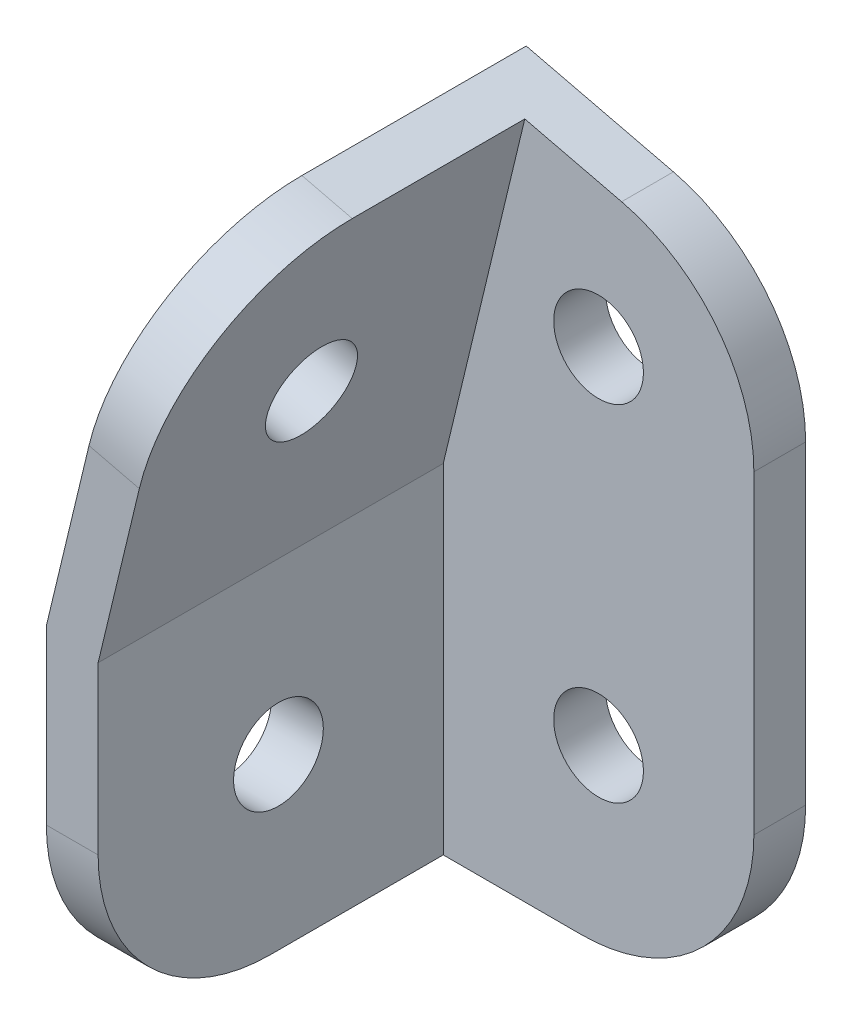
ISO-10303-21;
HEADER;
FILE_DESCRIPTION(('STEP AP214'),'2;1');
FILE_NAME('part.step','',(''),(''),'','','');
FILE_SCHEMA(('AUTOMOTIVE_DESIGN { 1 0 10303 214 1 1 1 1 }'));
ENDSEC;
DATA;
#1=APPLICATION_CONTEXT('core data for automotive mechanical design processes');
#2=APPLICATION_PROTOCOL_DEFINITION('international standard','automotive_design',2000,#1);
#3=PRODUCT_CONTEXT('',#1,'mechanical');
#4=PRODUCT('Part','Part','',(#3));
#5=PRODUCT_RELATED_PRODUCT_CATEGORY('part','',(#4));
#6=PRODUCT_DEFINITION_FORMATION('','',#4);
#7=PRODUCT_DEFINITION_CONTEXT('part definition',#1,'design');
#8=PRODUCT_DEFINITION('design','',#6,#7);
#9=PRODUCT_DEFINITION_SHAPE('','',#8);
#10=(LENGTH_UNIT() NAMED_UNIT(*) SI_UNIT(.MILLI.,.METRE.));
#11=(NAMED_UNIT(*) PLANE_ANGLE_UNIT() SI_UNIT($,.RADIAN.));
#12=(NAMED_UNIT(*) SI_UNIT($,.STERADIAN.) SOLID_ANGLE_UNIT());
#13=UNCERTAINTY_MEASURE_WITH_UNIT(LENGTH_MEASURE(1.E-05),#10,'distance_accuracy_value','');
#14=(GEOMETRIC_REPRESENTATION_CONTEXT(3) GLOBAL_UNCERTAINTY_ASSIGNED_CONTEXT((#13)) GLOBAL_UNIT_ASSIGNED_CONTEXT((#10,
#11,#12)) REPRESENTATION_CONTEXT('',''));
#15=CARTESIAN_POINT('',(0.,0.,0.));
#16=DIRECTION('',(0.,0.,1.));
#17=DIRECTION('',(1.,0.,0.));
#18=AXIS2_PLACEMENT_3D('',#15,#16,#17);
#19=CARTESIAN_POINT('',(-97.,305.5,23.));
#20=DIRECTION('',(-1.,0.,0.));
#21=DIRECTION('',(0.,0.,1.));
#22=AXIS2_PLACEMENT_3D('',#19,#20,#21);
#23=PLANE('',#22);
#24=CARTESIAN_POINT('',(-97.,315.322231982577,12.5490282018745));
#25=DIRECTION('',(1.,0.,0.));
#26=DIRECTION('',(0.,0.,-1.));
#27=AXIS2_PLACEMENT_3D('',#24,#25,#26);
#28=CIRCLE('',#27,2.6);
#29=CARTESIAN_POINT('',(-97.,315.322231982577,9.94902820187454));
#30=VERTEX_POINT('',#29);
#31=EDGE_CURVE('E250',#30,#30,#28,.T.);
#32=ORIENTED_EDGE('',*,*,#31,.F.);
#33=EDGE_LOOP('',(#32));
#34=FACE_BOUND('',#33,.T.);
#35=DIRECTION('',(0.,1.,0.));
#36=VECTOR('',#35,1.);
#37=CARTESIAN_POINT('',(-97.,305.5,23.));
#38=LINE('',#37,#36);
#39=CARTESIAN_POINT('',(-97.,315.5,23.));
#40=VERTEX_POINT('',#39);
#41=CARTESIAN_POINT('',(-97.,325.144463965153,23.));
#42=VERTEX_POINT('',#41);
#43=EDGE_CURVE('E145',#40,#42,#38,.T.);
#44=ORIENTED_EDGE('',*,*,#43,.F.);
#45=CARTESIAN_POINT('',(-97.,315.5,13.));
#46=DIRECTION('',(-1.,0.,0.));
#47=DIRECTION('',(0.,0.,1.));
#48=AXIS2_PLACEMENT_3D('',#45,#46,#47);
#49=CIRCLE('',#48,10.);
#50=CARTESIAN_POINT('',(-97.,305.5,13.));
#51=VERTEX_POINT('',#50);
#52=EDGE_CURVE('E160',#40,#51,#49,.F.);
#53=ORIENTED_EDGE('',*,*,#52,.T.);
#54=DIRECTION('',(0.,0.,-1.));
#55=VECTOR('',#54,1.);
#56=CARTESIAN_POINT('',(-97.,305.5,23.));
#57=LINE('',#56,#55);
#58=CARTESIAN_POINT('',(-97.,305.5,3.));
#59=VERTEX_POINT('',#58);
#60=EDGE_CURVE('E155',#51,#59,#57,.T.);
#61=ORIENTED_EDGE('',*,*,#60,.T.);
#62=DIRECTION('',(0.,-1.,0.));
#63=VECTOR('',#62,1.);
#64=CARTESIAN_POINT('',(-97.,305.5,3.));
#65=LINE('',#64,#63);
#66=CARTESIAN_POINT('',(-97.,325.144463965153,3.));
#67=VERTEX_POINT('',#66);
#68=EDGE_CURVE('E199',#67,#59,#65,.T.);
#69=ORIENTED_EDGE('',*,*,#68,.F.);
#70=DIRECTION('',(0.,0.,-1.));
#71=VECTOR('',#70,1.);
#72=CARTESIAN_POINT('',(-97.,325.144463965153,23.));
#73=LINE('',#72,#71);
#74=EDGE_CURVE('E222',#42,#67,#73,.T.);
#75=ORIENTED_EDGE('',*,*,#74,.F.);
#76=EDGE_LOOP('',(#44,#53,#61,#69,#75));
#77=FACE_BOUND('',#76,.T.);
#78=ADVANCED_FACE('F33',(#34,#77),#23,.F.);
#79=CARTESIAN_POINT('',(-97.,325.144463965153,23.));
#80=DIRECTION('',(-0.972298871243199,0.233741106738207,0.));
#81=DIRECTION('',(-0.233741106738207,-0.972298871243199,0.));
#82=AXIS2_PLACEMENT_3D('',#79,#80,#81);
#83=PLANE('',#82);
#84=CARTESIAN_POINT('',(-94.6375469817101,334.97162032247,13.));
#85=DIRECTION('',(0.972298871243199,-0.233741106738207,0.));
#86=DIRECTION('',(0.233741106738207,0.972298871243199,0.));
#87=AXIS2_PLACEMENT_3D('',#84,#85,#86);
#88=CIRCLE('',#87,2.60000000000001);
#89=CARTESIAN_POINT('',(-94.0298201041907,337.499597387702,13.));
#90=VERTEX_POINT('',#89);
#91=EDGE_CURVE('E256',#90,#90,#88,.T.);
#92=ORIENTED_EDGE('',*,*,#91,.F.);
#93=EDGE_LOOP('',(#92));
#94=FACE_BOUND('',#93,.T.);
#95=DIRECTION('',(0.,0.,-1.));
#96=VECTOR('',#95,1.);
#97=CARTESIAN_POINT('',(-92.27509396342,344.798776679785,23.));
#98=LINE('',#97,#96);
#99=CARTESIAN_POINT('',(-92.27509396342,344.798776679785,13.));
#100=VERTEX_POINT('',#99);
#101=CARTESIAN_POINT('',(-92.27509396342,344.798776679785,3.));
#102=VERTEX_POINT('',#101);
#103=EDGE_CURVE('E219',#100,#102,#98,.T.);
#104=ORIENTED_EDGE('',*,*,#103,.F.);
#105=CARTESIAN_POINT('',(-94.6125050308021,335.075787967354,13.));
#106=DIRECTION('',(-0.972298871243199,0.233741106738207,0.));
#107=DIRECTION('',(-0.233741106738207,-0.972298871243199,0.));
#108=AXIS2_PLACEMENT_3D('',#105,#106,#107);
#109=CIRCLE('',#108,10.);
#110=CARTESIAN_POINT('',(-94.6125050308021,335.075787967354,23.));
#111=VERTEX_POINT('',#110);
#112=EDGE_CURVE('E174',#100,#111,#109,.F.);
#113=ORIENTED_EDGE('',*,*,#112,.T.);
#114=DIRECTION('',(0.233741106738207,0.972298871243199,0.));
#115=VECTOR('',#114,1.);
#116=CARTESIAN_POINT('',(-97.,325.144463965153,23.));
#117=LINE('',#116,#115);
#118=EDGE_CURVE('E209',#42,#111,#117,.T.);
#119=ORIENTED_EDGE('',*,*,#118,.F.);
#120=ORIENTED_EDGE('',*,*,#74,.T.);
#121=DIRECTION('',(-0.233741106738207,-0.972298871243199,0.));
#122=VECTOR('',#121,1.);
#123=CARTESIAN_POINT('',(-97.,325.144463965153,3.));
#124=LINE('',#123,#122);
#125=EDGE_CURVE('E195',#102,#67,#124,.T.);
#126=ORIENTED_EDGE('',*,*,#125,.F.);
#127=EDGE_LOOP('',(#104,#113,#119,#120,#126));
#128=FACE_BOUND('',#127,.T.);
#129=ADVANCED_FACE('F271',(#94,#128),#83,.F.);
#130=CARTESIAN_POINT('',(-95.1919905771496,345.5,23.));
#131=DIRECTION('',(0.972298871243199,-0.233741106738206,0.));
#132=DIRECTION('',(0.233741106738206,0.972298871243199,0.));
#133=AXIS2_PLACEMENT_3D('',#130,#131,#132);
#134=PLANE('',#133);
#135=CARTESIAN_POINT('',(-97.5544435954397,335.672843642684,13.));
#136=DIRECTION('',(0.972298871243199,-0.233741106738207,0.));
#137=DIRECTION('',(0.233741106738207,0.972298871243199,0.));
#138=AXIS2_PLACEMENT_3D('',#135,#136,#137);
#139=CIRCLE('',#138,2.60000000000001);
#140=CARTESIAN_POINT('',(-96.9467167179203,338.200820707916,13.));
#141=VERTEX_POINT('',#140);
#142=EDGE_CURVE('E253',#141,#141,#139,.T.);
#143=ORIENTED_EDGE('',*,*,#142,.T.);
#144=EDGE_LOOP('',(#143));
#145=FACE_BOUND('',#144,.T.);
#146=DIRECTION('',(-0.233741106738206,-0.972298871243199,0.));
#147=VECTOR('',#146,1.);
#148=CARTESIAN_POINT('',(-95.1919905771496,345.5,23.));
#149=LINE('',#148,#147);
#150=CARTESIAN_POINT('',(-97.5294016445316,335.777011287568,23.));
#151=VERTEX_POINT('',#150);
#152=CARTESIAN_POINT('',(-100.,325.5,23.));
#153=VERTEX_POINT('',#152);
#154=EDGE_CURVE('E123',#151,#153,#149,.T.);
#155=ORIENTED_EDGE('',*,*,#154,.F.);
#156=CARTESIAN_POINT('',(-97.5294016445316,335.777011287568,13.));
#157=DIRECTION('',(0.972298871243199,-0.233741106738206,0.));
#158=DIRECTION('',(0.233741106738206,0.972298871243199,0.));
#159=AXIS2_PLACEMENT_3D('',#156,#157,#158);
#160=CIRCLE('',#159,10.);
#161=CARTESIAN_POINT('',(-95.1919905771496,345.5,13.));
#162=VERTEX_POINT('',#161);
#163=EDGE_CURVE('E167',#151,#162,#160,.F.);
#164=ORIENTED_EDGE('',*,*,#163,.T.);
#165=DIRECTION('',(0.,0.,-1.));
#166=VECTOR('',#165,1.);
#167=CARTESIAN_POINT('',(-95.1919905771496,345.5,23.));
#168=LINE('',#167,#166);
#169=CARTESIAN_POINT('',(-95.1919905771496,345.5,0.));
#170=VERTEX_POINT('',#169);
#171=EDGE_CURVE('E211',#162,#170,#168,.T.);
#172=ORIENTED_EDGE('',*,*,#171,.T.);
#173=DIRECTION('',(-0.233741106738206,-0.972298871243199,0.));
#174=VECTOR('',#173,1.);
#175=CARTESIAN_POINT('',(-95.1919905771496,345.5,0.));
#176=LINE('',#175,#174);
#177=CARTESIAN_POINT('',(-100.,325.5,0.));
#178=VERTEX_POINT('',#177);
#179=EDGE_CURVE('E150',#170,#178,#176,.T.);
#180=ORIENTED_EDGE('',*,*,#179,.T.);
#181=DIRECTION('',(0.,0.,-1.));
#182=VECTOR('',#181,1.);
#183=CARTESIAN_POINT('',(-100.,325.5,23.));
#184=LINE('',#183,#182);
#185=EDGE_CURVE('E141',#153,#178,#184,.T.);
#186=ORIENTED_EDGE('',*,*,#185,.F.);
#187=EDGE_LOOP('',(#155,#164,#172,#180,#186));
#188=FACE_BOUND('',#187,.T.);
#189=ADVANCED_FACE('F147',(#145,#188),#134,.F.);
#190=CARTESIAN_POINT('',(-100.,325.5,23.));
#191=DIRECTION('',(1.,0.,0.));
#192=DIRECTION('',(0.,0.,-1.));
#193=AXIS2_PLACEMENT_3D('',#190,#191,#192);
#194=PLANE('',#193);
#195=CARTESIAN_POINT('',(-100.,315.322231982577,12.5490282018745));
#196=DIRECTION('',(1.,0.,0.));
#197=DIRECTION('',(0.,0.,-1.));
#198=AXIS2_PLACEMENT_3D('',#195,#196,#197);
#199=CIRCLE('',#198,2.6);
#200=CARTESIAN_POINT('',(-100.,315.322231982577,9.94902820187454));
#201=VERTEX_POINT('',#200);
#202=EDGE_CURVE('E247',#201,#201,#199,.T.);
#203=ORIENTED_EDGE('',*,*,#202,.T.);
#204=EDGE_LOOP('',(#203));
#205=FACE_BOUND('',#204,.T.);
#206=DIRECTION('',(0.,0.,-1.));
#207=VECTOR('',#206,1.);
#208=CARTESIAN_POINT('',(-100.,305.5,23.));
#209=LINE('',#208,#207);
#210=CARTESIAN_POINT('',(-100.,305.5,13.));
#211=VERTEX_POINT('',#210);
#212=CARTESIAN_POINT('',(-100.,305.5,0.));
#213=VERTEX_POINT('',#212);
#214=EDGE_CURVE('E151',#211,#213,#209,.T.);
#215=ORIENTED_EDGE('',*,*,#214,.F.);
#216=CARTESIAN_POINT('',(-100.,315.5,13.));
#217=DIRECTION('',(1.,0.,0.));
#218=DIRECTION('',(0.,0.,-1.));
#219=AXIS2_PLACEMENT_3D('',#216,#217,#218);
#220=CIRCLE('',#219,10.);
#221=CARTESIAN_POINT('',(-100.,315.5,23.));
#222=VERTEX_POINT('',#221);
#223=EDGE_CURVE('E144',#211,#222,#220,.F.);
#224=ORIENTED_EDGE('',*,*,#223,.T.);
#225=DIRECTION('',(0.,-1.,0.));
#226=VECTOR('',#225,1.);
#227=CARTESIAN_POINT('',(-100.,325.5,23.));
#228=LINE('',#227,#226);
#229=EDGE_CURVE('E127',#153,#222,#228,.T.);
#230=ORIENTED_EDGE('',*,*,#229,.F.);
#231=ORIENTED_EDGE('',*,*,#185,.T.);
#232=DIRECTION('',(0.,-1.,0.));
#233=VECTOR('',#232,1.);
#234=CARTESIAN_POINT('',(-100.,325.5,0.));
#235=LINE('',#234,#233);
#236=EDGE_CURVE('E213',#178,#213,#235,.T.);
#237=ORIENTED_EDGE('',*,*,#236,.T.);
#238=EDGE_LOOP('',(#215,#224,#230,#231,#237));
#239=FACE_BOUND('',#238,.T.);
#240=ADVANCED_FACE('F139',(#205,#239),#194,.F.);
#241=CARTESIAN_POINT('',(-100.,305.5,23.));
#242=DIRECTION('',(0.,1.,0.));
#243=DIRECTION('',(0.,0.,1.));
#244=AXIS2_PLACEMENT_3D('',#241,#242,#243);
#245=PLANE('',#244);
#246=ORIENTED_EDGE('',*,*,#60,.F.);
#247=DIRECTION('',(1.,0.,0.));
#248=VECTOR('',#247,1.);
#249=CARTESIAN_POINT('',(-100.,305.5,13.));
#250=LINE('',#249,#248);
#251=EDGE_CURVE('E164',#51,#211,#250,.F.);
#252=ORIENTED_EDGE('',*,*,#251,.T.);
#253=ORIENTED_EDGE('',*,*,#214,.T.);
#254=DIRECTION('',(1.,0.,0.));
#255=VECTOR('',#254,1.);
#256=CARTESIAN_POINT('',(-100.,305.5,0.));
#257=LINE('',#256,#255);
#258=CARTESIAN_POINT('',(-89.,305.5,0.));
#259=VERTEX_POINT('',#258);
#260=EDGE_CURVE('E215',#213,#259,#257,.T.);
#261=ORIENTED_EDGE('',*,*,#260,.T.);
#262=DIRECTION('',(0.,0.,-1.));
#263=VECTOR('',#262,1.);
#264=CARTESIAN_POINT('',(-89.,305.5,23.));
#265=LINE('',#264,#263);
#266=CARTESIAN_POINT('',(-89.,305.5,3.));
#267=VERTEX_POINT('',#266);
#268=EDGE_CURVE('E162',#259,#267,#265,.F.);
#269=ORIENTED_EDGE('',*,*,#268,.T.);
#270=DIRECTION('',(1.,0.,0.));
#271=VECTOR('',#270,1.);
#272=CARTESIAN_POINT('',(-79.,305.5,3.));
#273=LINE('',#272,#271);
#274=EDGE_CURVE('E234',#59,#267,#273,.T.);
#275=ORIENTED_EDGE('',*,*,#274,.F.);
#276=EDGE_LOOP('',(#246,#252,#253,#261,#269,#275));
#277=FACE_BOUND('',#276,.T.);
#278=ADVANCED_FACE('F237',(#277),#245,.F.);
#279=CARTESIAN_POINT('',(-92.27509396342,344.798776679785,23.));
#280=DIRECTION('',(-0.233741106738203,-0.972298871243199,0.));
#281=DIRECTION('',(0.9722988712432,-0.233741106738203,0.));
#282=AXIS2_PLACEMENT_3D('',#279,#280,#281);
#283=PLANE('',#282);
#284=ORIENTED_EDGE('',*,*,#171,.F.);
#285=DIRECTION('',(-0.9722988712432,0.233741106738203,0.));
#286=VECTOR('',#285,1.);
#287=CARTESIAN_POINT('',(-92.27509396342,344.798776679785,13.));
#288=LINE('',#287,#286);
#289=EDGE_CURVE('E172',#162,#100,#288,.F.);
#290=ORIENTED_EDGE('',*,*,#289,.T.);
#291=ORIENTED_EDGE('',*,*,#103,.T.);
#292=DIRECTION('',(-0.9722988712432,0.233741106738201,0.));
#293=VECTOR('',#292,1.);
#294=CARTESIAN_POINT('',(-92.27509396342,344.798776679785,3.));
#295=LINE('',#294,#293);
#296=CARTESIAN_POINT('',(-86.6625889326179,343.449527826091,3.));
#297=VERTEX_POINT('',#296);
#298=EDGE_CURVE('E205',#297,#102,#295,.T.);
#299=ORIENTED_EDGE('',*,*,#298,.F.);
#300=DIRECTION('',(0.,0.,-1.));
#301=VECTOR('',#300,1.);
#302=CARTESIAN_POINT('',(-86.662588932618,343.449527826091,23.));
#303=LINE('',#302,#301);
#304=CARTESIAN_POINT('',(-86.6625889326179,343.449527826091,0.));
#305=VERTEX_POINT('',#304);
#306=EDGE_CURVE('E169',#297,#305,#303,.T.);
#307=ORIENTED_EDGE('',*,*,#306,.T.);
#308=DIRECTION('',(-0.9722988712432,0.233741106738203,0.));
#309=VECTOR('',#308,1.);
#310=CARTESIAN_POINT('',(-92.27509396342,344.798776679785,0.));
#311=LINE('',#310,#309);
#312=EDGE_CURVE('E134',#305,#170,#311,.T.);
#313=ORIENTED_EDGE('',*,*,#312,.T.);
#314=EDGE_LOOP('',(#284,#290,#291,#299,#307,#313));
#315=FACE_BOUND('',#314,.T.);
#316=ADVANCED_FACE('F284',(#315),#283,.F.);
#317=CARTESIAN_POINT('',(0.,0.,23.));
#318=DIRECTION('',(0.,0.,-1.));
#319=DIRECTION('',(-1.,0.,0.));
#320=AXIS2_PLACEMENT_3D('',#317,#318,#319);
#321=PLANE('',#320);
#322=ORIENTED_EDGE('',*,*,#229,.T.);
#323=DIRECTION('',(1.,0.,0.));
#324=VECTOR('',#323,1.);
#325=CARTESIAN_POINT('',(0.,315.5,23.));
#326=LINE('',#325,#324);
#327=EDGE_CURVE('E153',#222,#40,#326,.T.);
#328=ORIENTED_EDGE('',*,*,#327,.T.);
#329=ORIENTED_EDGE('',*,*,#43,.T.);
#330=ORIENTED_EDGE('',*,*,#118,.T.);
#331=DIRECTION('',(-0.9722988712432,0.233741106738203,0.));
#332=VECTOR('',#331,1.);
#333=CARTESIAN_POINT('',(70.9822605941953,295.266728292369,23.));
#334=LINE('',#333,#332);
#335=EDGE_CURVE('E131',#111,#151,#334,.T.);
#336=ORIENTED_EDGE('',*,*,#335,.T.);
#337=ORIENTED_EDGE('',*,*,#154,.T.);
#338=EDGE_LOOP('',(#322,#328,#329,#330,#336,#337));
#339=FACE_BOUND('',#338,.T.);
#340=ADVANCED_FACE('F125',(#339),#321,.F.);
#341=CARTESIAN_POINT('',(0.,0.,0.));
#342=DIRECTION('',(0.,0.,-1.));
#343=DIRECTION('',(-1.,0.,0.));
#344=AXIS2_PLACEMENT_3D('',#341,#342,#343);
#345=PLANE('',#344);
#346=ORIENTED_EDGE('',*,*,#312,.F.);
#347=CARTESIAN_POINT('',(-89.,333.726539113659,0.));
#348=DIRECTION('',(0.,0.,-1.));
#349=DIRECTION('',(-1.,0.,0.));
#350=AXIS2_PLACEMENT_3D('',#347,#348,#349);
#351=CIRCLE('',#350,10.);
#352=CARTESIAN_POINT('',(-79.,333.726539113659,0.));
#353=VERTEX_POINT('',#352);
#354=EDGE_CURVE('E178',#305,#353,#351,.T.);
#355=ORIENTED_EDGE('',*,*,#354,.T.);
#356=DIRECTION('',(0.,1.,0.));
#357=VECTOR('',#356,1.);
#358=CARTESIAN_POINT('',(-79.,341.607437836518,0.));
#359=LINE('',#358,#357);
#360=CARTESIAN_POINT('',(-79.,315.5,0.));
#361=VERTEX_POINT('',#360);
#362=EDGE_CURVE('E186',#361,#353,#359,.T.);
#363=ORIENTED_EDGE('',*,*,#362,.F.);
#364=CARTESIAN_POINT('',(-89.,315.5,0.));
#365=DIRECTION('',(0.,0.,-1.));
#366=DIRECTION('',(-1.,0.,0.));
#367=AXIS2_PLACEMENT_3D('',#364,#365,#366);
#368=CIRCLE('',#367,10.);
#369=EDGE_CURVE('E176',#361,#259,#368,.T.);
#370=ORIENTED_EDGE('',*,*,#369,.T.);
#371=ORIENTED_EDGE('',*,*,#260,.F.);
#372=ORIENTED_EDGE('',*,*,#236,.F.);
#373=ORIENTED_EDGE('',*,*,#179,.F.);
#374=EDGE_LOOP('',(#346,#355,#363,#370,#371,#372,#373));
#375=FACE_BOUND('',#374,.T.);
#376=CARTESIAN_POINT('',(-88.,315.5,0.));
#377=DIRECTION('',(0.,0.,1.));
#378=DIRECTION('',(1.,0.,0.));
#379=AXIS2_PLACEMENT_3D('',#376,#377,#378);
#380=CIRCLE('',#379,2.6);
#381=CARTESIAN_POINT('',(-85.4,315.5,0.));
#382=VERTEX_POINT('',#381);
#383=EDGE_CURVE('E202',#382,#382,#380,.T.);
#384=ORIENTED_EDGE('',*,*,#383,.T.);
#385=EDGE_LOOP('',(#384));
#386=FACE_BOUND('',#385,.T.);
#387=CARTESIAN_POINT('',(-88.,335.5,0.));
#388=DIRECTION('',(0.,0.,1.));
#389=DIRECTION('',(1.,0.,0.));
#390=AXIS2_PLACEMENT_3D('',#387,#388,#389);
#391=CIRCLE('',#390,2.6);
#392=CARTESIAN_POINT('',(-85.4,335.5,0.));
#393=VERTEX_POINT('',#392);
#394=EDGE_CURVE('E244',#393,#393,#391,.T.);
#395=ORIENTED_EDGE('',*,*,#394,.T.);
#396=EDGE_LOOP('',(#395));
#397=FACE_BOUND('',#396,.T.);
#398=ADVANCED_FACE('F191',(#375,#386,#397),#345,.T.);
#399=CARTESIAN_POINT('',(0.,0.,3.));
#400=DIRECTION('',(0.,0.,-1.));
#401=DIRECTION('',(-1.,0.,0.));
#402=AXIS2_PLACEMENT_3D('',#399,#400,#401);
#403=PLANE('',#402);
#404=DIRECTION('',(0.,1.,0.));
#405=VECTOR('',#404,1.);
#406=CARTESIAN_POINT('',(-79.,341.607437836518,3.));
#407=LINE('',#406,#405);
#408=CARTESIAN_POINT('',(-79.,315.5,3.));
#409=VERTEX_POINT('',#408);
#410=CARTESIAN_POINT('',(-79.,333.726539113659,3.));
#411=VERTEX_POINT('',#410);
#412=EDGE_CURVE('E187',#409,#411,#407,.T.);
#413=ORIENTED_EDGE('',*,*,#412,.T.);
#414=CARTESIAN_POINT('',(-89.,333.726539113659,3.));
#415=DIRECTION('',(0.,0.,-1.));
#416=DIRECTION('',(-1.,0.,0.));
#417=AXIS2_PLACEMENT_3D('',#414,#415,#416);
#418=CIRCLE('',#417,10.);
#419=EDGE_CURVE('E11',#411,#297,#418,.F.);
#420=ORIENTED_EDGE('',*,*,#419,.T.);
#421=ORIENTED_EDGE('',*,*,#298,.T.);
#422=ORIENTED_EDGE('',*,*,#125,.T.);
#423=ORIENTED_EDGE('',*,*,#68,.T.);
#424=ORIENTED_EDGE('',*,*,#274,.T.);
#425=CARTESIAN_POINT('',(-89.,315.5,3.));
#426=DIRECTION('',(0.,0.,-1.));
#427=DIRECTION('',(-1.,0.,0.));
#428=AXIS2_PLACEMENT_3D('',#425,#426,#427);
#429=CIRCLE('',#428,10.);
#430=EDGE_CURVE('E41',#267,#409,#429,.F.);
#431=ORIENTED_EDGE('',*,*,#430,.T.);
#432=EDGE_LOOP('',(#413,#420,#421,#422,#423,#424,#431));
#433=FACE_BOUND('',#432,.T.);
#434=CARTESIAN_POINT('',(-88.,315.5,3.));
#435=DIRECTION('',(0.,0.,1.));
#436=DIRECTION('',(1.,0.,0.));
#437=AXIS2_PLACEMENT_3D('',#434,#435,#436);
#438=CIRCLE('',#437,2.6);
#439=CARTESIAN_POINT('',(-85.4,315.5,3.));
#440=VERTEX_POINT('',#439);
#441=EDGE_CURVE('E196',#440,#440,#438,.T.);
#442=ORIENTED_EDGE('',*,*,#441,.F.);
#443=EDGE_LOOP('',(#442));
#444=FACE_BOUND('',#443,.T.);
#445=CARTESIAN_POINT('',(-88.,335.5,3.));
#446=DIRECTION('',(0.,0.,1.));
#447=DIRECTION('',(1.,0.,0.));
#448=AXIS2_PLACEMENT_3D('',#445,#446,#447);
#449=CIRCLE('',#448,2.6);
#450=CARTESIAN_POINT('',(-85.4,335.5,3.));
#451=VERTEX_POINT('',#450);
#452=EDGE_CURVE('E242',#451,#451,#449,.T.);
#453=ORIENTED_EDGE('',*,*,#452,.F.);
#454=EDGE_LOOP('',(#453));
#455=FACE_BOUND('',#454,.T.);
#456=ADVANCED_FACE('F232',(#433,#444,#455),#403,.F.);
#457=CARTESIAN_POINT('',(-79.,341.607437836518,3.));
#458=DIRECTION('',(-1.,0.,0.));
#459=DIRECTION('',(0.,0.,1.));
#460=AXIS2_PLACEMENT_3D('',#457,#458,#459);
#461=PLANE('',#460);
#462=ORIENTED_EDGE('',*,*,#362,.T.);
#463=DIRECTION('',(0.,0.,-1.));
#464=VECTOR('',#463,1.);
#465=CARTESIAN_POINT('',(-79.,333.726539113659,3.));
#466=LINE('',#465,#464);
#467=EDGE_CURVE('E48',#353,#411,#466,.F.);
#468=ORIENTED_EDGE('',*,*,#467,.T.);
#469=ORIENTED_EDGE('',*,*,#412,.F.);
#470=DIRECTION('',(0.,0.,-1.));
#471=VECTOR('',#470,1.);
#472=CARTESIAN_POINT('',(-79.,315.5,3.));
#473=LINE('',#472,#471);
#474=EDGE_CURVE('E180',#409,#361,#473,.T.);
#475=ORIENTED_EDGE('',*,*,#474,.T.);
#476=EDGE_LOOP('',(#462,#468,#469,#475));
#477=FACE_BOUND('',#476,.T.);
#478=ADVANCED_FACE('F185',(#477),#461,.F.);
#479=CARTESIAN_POINT('',(-88.,315.5,3.));
#480=DIRECTION('',(0.,0.,-1.));
#481=DIRECTION('',(-1.,0.,0.));
#482=AXIS2_PLACEMENT_3D('',#479,#480,#481);
#483=CYLINDRICAL_SURFACE('',#482,2.6);
#484=ORIENTED_EDGE('',*,*,#441,.T.);
#485=EDGE_LOOP('',(#484));
#486=FACE_BOUND('',#485,.T.);
#487=ORIENTED_EDGE('',*,*,#383,.F.);
#488=EDGE_LOOP('',(#487));
#489=FACE_BOUND('',#488,.T.);
#490=ADVANCED_FACE('F349',(#486,#489),#483,.F.);
#491=CARTESIAN_POINT('',(-88.,335.5,3.));
#492=DIRECTION('',(0.,0.,-1.));
#493=DIRECTION('',(-1.,0.,0.));
#494=AXIS2_PLACEMENT_3D('',#491,#492,#493);
#495=CYLINDRICAL_SURFACE('',#494,2.6);
#496=ORIENTED_EDGE('',*,*,#452,.T.);
#497=EDGE_LOOP('',(#496));
#498=FACE_BOUND('',#497,.T.);
#499=ORIENTED_EDGE('',*,*,#394,.F.);
#500=EDGE_LOOP('',(#499));
#501=FACE_BOUND('',#500,.T.);
#502=ADVANCED_FACE('F356',(#498,#501),#495,.F.);
#503=CARTESIAN_POINT('',(-100.,315.322231982577,12.5490282018745));
#504=DIRECTION('',(1.,0.,0.));
#505=DIRECTION('',(0.,0.,-1.));
#506=AXIS2_PLACEMENT_3D('',#503,#504,#505);
#507=CYLINDRICAL_SURFACE('',#506,2.6);
#508=ORIENTED_EDGE('',*,*,#202,.F.);
#509=EDGE_LOOP('',(#508));
#510=FACE_BOUND('',#509,.T.);
#511=ORIENTED_EDGE('',*,*,#31,.T.);
#512=EDGE_LOOP('',(#511));
#513=FACE_BOUND('',#512,.T.);
#514=ADVANCED_FACE('F267',(#510,#513),#507,.F.);
#515=CARTESIAN_POINT('',(-97.5544435954397,335.672843642684,13.));
#516=DIRECTION('',(0.972298871243199,-0.233741106738207,0.));
#517=DIRECTION('',(0.233741106738207,0.972298871243199,0.));
#518=AXIS2_PLACEMENT_3D('',#515,#516,#517);
#519=CYLINDRICAL_SURFACE('',#518,2.60000000000001);
#520=ORIENTED_EDGE('',*,*,#142,.F.);
#521=EDGE_LOOP('',(#520));
#522=FACE_BOUND('',#521,.T.);
#523=ORIENTED_EDGE('',*,*,#91,.T.);
#524=EDGE_LOOP('',(#523));
#525=FACE_BOUND('',#524,.T.);
#526=ADVANCED_FACE('F263',(#522,#525),#519,.F.);
#527=CARTESIAN_POINT('',(0.,315.5,13.));
#528=DIRECTION('',(1.,0.,0.));
#529=DIRECTION('',(0.,0.,-1.));
#530=AXIS2_PLACEMENT_3D('',#527,#528,#529);
#531=CYLINDRICAL_SURFACE('',#530,10.);
#532=ORIENTED_EDGE('',*,*,#223,.F.);
#533=ORIENTED_EDGE('',*,*,#251,.F.);
#534=ORIENTED_EDGE('',*,*,#52,.F.);
#535=ORIENTED_EDGE('',*,*,#327,.F.);
#536=EDGE_LOOP('',(#532,#533,#534,#535));
#537=FACE_BOUND('',#536,.T.);
#538=ADVANCED_FACE('F266',(#537),#531,.T.);
#539=CARTESIAN_POINT('',(70.9822605941953,295.266728292369,13.));
#540=DIRECTION('',(-0.9722988712432,0.233741106738203,0.));
#541=DIRECTION('',(-0.233741106738203,-0.9722988712432,0.));
#542=AXIS2_PLACEMENT_3D('',#539,#540,#541);
#543=CYLINDRICAL_SURFACE('',#542,10.);
#544=ORIENTED_EDGE('',*,*,#112,.F.);
#545=ORIENTED_EDGE('',*,*,#289,.F.);
#546=ORIENTED_EDGE('',*,*,#163,.F.);
#547=ORIENTED_EDGE('',*,*,#335,.F.);
#548=EDGE_LOOP('',(#544,#545,#546,#547));
#549=FACE_BOUND('',#548,.T.);
#550=ADVANCED_FACE('F282',(#549),#543,.T.);
#551=CARTESIAN_POINT('',(-89.,333.726539113659,23.));
#552=DIRECTION('',(0.,0.,-1.));
#553=DIRECTION('',(-1.,0.,0.));
#554=AXIS2_PLACEMENT_3D('',#551,#552,#553);
#555=CYLINDRICAL_SURFACE('',#554,10.);
#556=ORIENTED_EDGE('',*,*,#419,.F.);
#557=ORIENTED_EDGE('',*,*,#467,.F.);
#558=ORIENTED_EDGE('',*,*,#354,.F.);
#559=ORIENTED_EDGE('',*,*,#306,.F.);
#560=EDGE_LOOP('',(#556,#557,#558,#559));
#561=FACE_BOUND('',#560,.T.);
#562=ADVANCED_FACE('F292',(#561),#555,.T.);
#563=CARTESIAN_POINT('',(-89.,315.5,3.));
#564=DIRECTION('',(0.,0.,-1.));
#565=DIRECTION('',(-1.,0.,0.));
#566=AXIS2_PLACEMENT_3D('',#563,#564,#565);
#567=CYLINDRICAL_SURFACE('',#566,10.);
#568=ORIENTED_EDGE('',*,*,#430,.F.);
#569=ORIENTED_EDGE('',*,*,#268,.F.);
#570=ORIENTED_EDGE('',*,*,#369,.F.);
#571=ORIENTED_EDGE('',*,*,#474,.F.);
#572=EDGE_LOOP('',(#568,#569,#570,#571));
#573=FACE_BOUND('',#572,.T.);
#574=ADVANCED_FACE('F35',(#573),#567,.T.);
#575=CLOSED_SHELL('',(#78,#129,#189,#240,#278,#316,#340,#398,#456,#478,#490,#502,#514,#526,#538,
#550,#562,#574));
#576=MANIFOLD_SOLID_BREP('B2',#575);
#577=ADVANCED_BREP_SHAPE_REPRESENTATION('',(#18,#576),#14);
#578=SHAPE_DEFINITION_REPRESENTATION(#9,#577);
ENDSEC;
END-ISO-10303-21;
